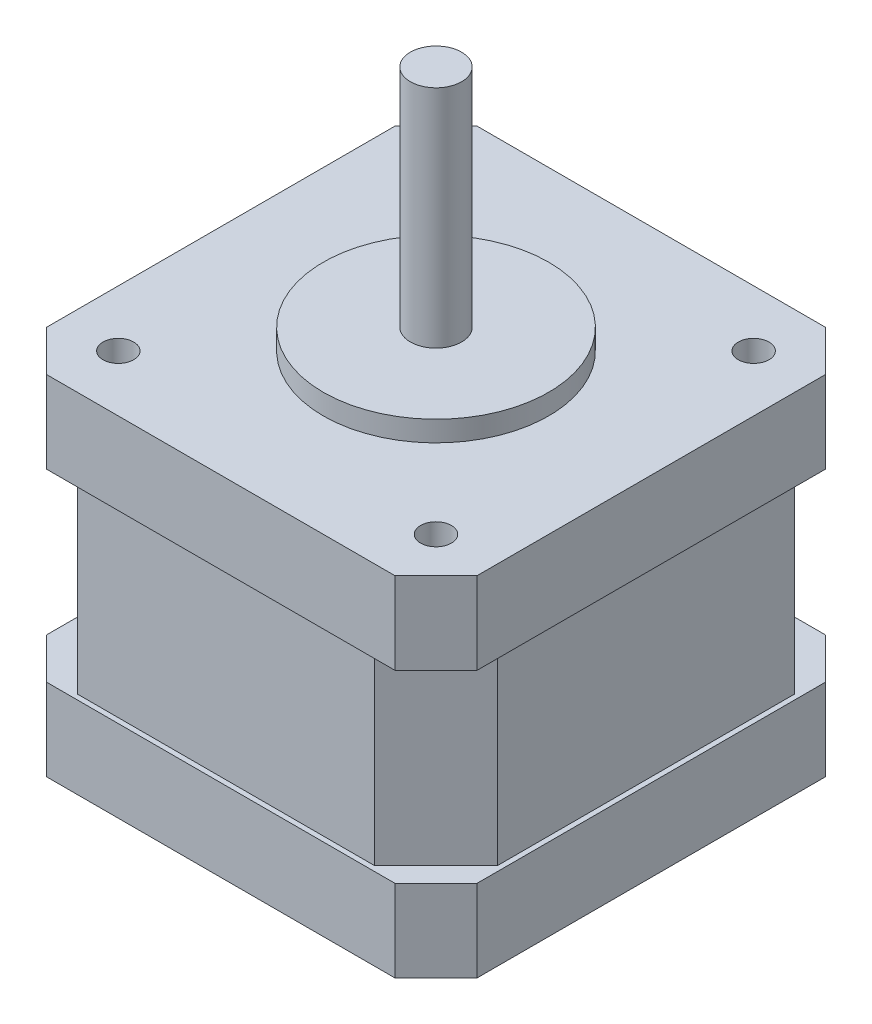
ISO-10303-21;
HEADER;
FILE_DESCRIPTION(('STEP AP214'),'2;1');
FILE_NAME('part.step','',(''),(''),'','','');
FILE_SCHEMA(('AUTOMOTIVE_DESIGN { 1 0 10303 214 1 1 1 1 }'));
ENDSEC;
DATA;
#1=APPLICATION_CONTEXT('core data for automotive mechanical design processes');
#2=APPLICATION_PROTOCOL_DEFINITION('international standard','automotive_design',2000,#1);
#3=PRODUCT_CONTEXT('',#1,'mechanical');
#4=PRODUCT('Part','Part','',(#3));
#5=PRODUCT_RELATED_PRODUCT_CATEGORY('part','',(#4));
#6=PRODUCT_DEFINITION_FORMATION('','',#4);
#7=PRODUCT_DEFINITION_CONTEXT('part definition',#1,'design');
#8=PRODUCT_DEFINITION('design','',#6,#7);
#9=PRODUCT_DEFINITION_SHAPE('','',#8);
#10=(LENGTH_UNIT() NAMED_UNIT(*) SI_UNIT(.MILLI.,.METRE.));
#11=(NAMED_UNIT(*) PLANE_ANGLE_UNIT() SI_UNIT($,.RADIAN.));
#12=(NAMED_UNIT(*) SI_UNIT($,.STERADIAN.) SOLID_ANGLE_UNIT());
#13=UNCERTAINTY_MEASURE_WITH_UNIT(LENGTH_MEASURE(1.E-05),#10,'distance_accuracy_value','');
#14=(GEOMETRIC_REPRESENTATION_CONTEXT(3) GLOBAL_UNCERTAINTY_ASSIGNED_CONTEXT((#13)) GLOBAL_UNIT_ASSIGNED_CONTEXT((#10,
#11,#12)) REPRESENTATION_CONTEXT('',''));
#15=CARTESIAN_POINT('',(0.,0.,0.));
#16=DIRECTION('',(0.,0.,1.));
#17=DIRECTION('',(1.,0.,0.));
#18=AXIS2_PLACEMENT_3D('',#15,#16,#17);
#19=CARTESIAN_POINT('',(0.,10.,0.));
#20=DIRECTION('',(0.,1.,0.));
#21=DIRECTION('',(0.,0.,1.));
#22=AXIS2_PLACEMENT_3D('',#19,#20,#21);
#23=PLANE('',#22);
#24=CARTESIAN_POINT('',(0.,10.,0.));
#25=DIRECTION('',(0.,1.,0.));
#26=DIRECTION('',(0.,0.,1.));
#27=AXIS2_PLACEMENT_3D('',#24,#25,#26);
#28=CIRCLE('',#27,11.);
#29=CARTESIAN_POINT('',(0.,10.,11.));
#30=VERTEX_POINT('',#29);
#31=EDGE_CURVE('E483',#30,#30,#28,.T.);
#32=ORIENTED_EDGE('',*,*,#31,.T.);
#33=EDGE_LOOP('',(#32));
#34=FACE_BOUND('',#33,.T.);
#35=CARTESIAN_POINT('',(0.,10.,0.));
#36=DIRECTION('',(0.,1.,0.));
#37=DIRECTION('',(0.,0.,1.));
#38=AXIS2_PLACEMENT_3D('',#35,#36,#37);
#39=CIRCLE('',#38,2.5);
#40=CARTESIAN_POINT('',(0.,10.,2.5));
#41=VERTEX_POINT('',#40);
#42=EDGE_CURVE('E499',#41,#41,#39,.T.);
#43=ORIENTED_EDGE('',*,*,#42,.F.);
#44=EDGE_LOOP('',(#43));
#45=FACE_BOUND('',#44,.T.);
#46=ADVANCED_FACE('F36',(#34,#45),#23,.T.);
#47=CARTESIAN_POINT('',(0.,8.,0.));
#48=DIRECTION('',(0.,1.,0.));
#49=DIRECTION('',(0.,0.,1.));
#50=AXIS2_PLACEMENT_3D('',#47,#48,#49);
#51=PLANE('',#50);
#52=CARTESIAN_POINT('',(-15.5,8.,15.5));
#53=DIRECTION('',(0.,1.,0.));
#54=DIRECTION('',(0.,0.,1.));
#55=AXIS2_PLACEMENT_3D('',#52,#53,#54);
#56=CIRCLE('',#55,1.5);
#57=CARTESIAN_POINT('',(-15.5,8.,17.));
#58=VERTEX_POINT('',#57);
#59=EDGE_CURVE('E523',#58,#58,#56,.T.);
#60=ORIENTED_EDGE('',*,*,#59,.F.);
#61=EDGE_LOOP('',(#60));
#62=FACE_BOUND('',#61,.T.);
#63=CARTESIAN_POINT('',(15.5,8.,15.5));
#64=DIRECTION('',(0.,1.,0.));
#65=DIRECTION('',(0.,0.,1.));
#66=AXIS2_PLACEMENT_3D('',#63,#64,#65);
#67=CIRCLE('',#66,1.5);
#68=CARTESIAN_POINT('',(15.5,8.,17.));
#69=VERTEX_POINT('',#68);
#70=EDGE_CURVE('E517',#69,#69,#67,.T.);
#71=ORIENTED_EDGE('',*,*,#70,.F.);
#72=EDGE_LOOP('',(#71));
#73=FACE_BOUND('',#72,.T.);
#74=CARTESIAN_POINT('',(15.5,8.,-15.5));
#75=DIRECTION('',(0.,1.,0.));
#76=DIRECTION('',(0.,0.,1.));
#77=AXIS2_PLACEMENT_3D('',#74,#75,#76);
#78=CIRCLE('',#77,1.5);
#79=CARTESIAN_POINT('',(15.5,8.,-14.));
#80=VERTEX_POINT('',#79);
#81=EDGE_CURVE('E511',#80,#80,#78,.T.);
#82=ORIENTED_EDGE('',*,*,#81,.F.);
#83=EDGE_LOOP('',(#82));
#84=FACE_BOUND('',#83,.T.);
#85=CARTESIAN_POINT('',(-15.5,8.,-15.5));
#86=DIRECTION('',(0.,1.,0.));
#87=DIRECTION('',(0.,0.,1.));
#88=AXIS2_PLACEMENT_3D('',#85,#86,#87);
#89=CIRCLE('',#88,1.5);
#90=CARTESIAN_POINT('',(-15.5,8.,-14.));
#91=VERTEX_POINT('',#90);
#92=EDGE_CURVE('E505',#91,#91,#89,.T.);
#93=ORIENTED_EDGE('',*,*,#92,.F.);
#94=EDGE_LOOP('',(#93));
#95=FACE_BOUND('',#94,.T.);
#96=DIRECTION('',(-1.,0.,0.));
#97=VECTOR('',#96,1.);
#98=CARTESIAN_POINT('',(-21.,8.,-21.));
#99=LINE('',#98,#97);
#100=CARTESIAN_POINT('',(17.,8.,-21.));
#101=VERTEX_POINT('',#100);
#102=CARTESIAN_POINT('',(-17.,8.,-21.));
#103=VERTEX_POINT('',#102);
#104=EDGE_CURVE('E209',#101,#103,#99,.T.);
#105=ORIENTED_EDGE('',*,*,#104,.T.);
#106=DIRECTION('',(0.707106781186549,0.,-0.707106781186546));
#107=VECTOR('',#106,1.);
#108=CARTESIAN_POINT('',(-19.,8.,-19.));
#109=LINE('',#108,#107);
#110=CARTESIAN_POINT('',(-21.,8.,-17.));
#111=VERTEX_POINT('',#110);
#112=EDGE_CURVE('E297',#103,#111,#109,.F.);
#113=ORIENTED_EDGE('',*,*,#112,.T.);
#114=DIRECTION('',(0.,0.,1.));
#115=VECTOR('',#114,1.);
#116=CARTESIAN_POINT('',(-21.,8.,-21.));
#117=LINE('',#116,#115);
#118=CARTESIAN_POINT('',(-21.,8.,17.));
#119=VERTEX_POINT('',#118);
#120=EDGE_CURVE('E321',#111,#119,#117,.T.);
#121=ORIENTED_EDGE('',*,*,#120,.T.);
#122=DIRECTION('',(-0.707106781186546,0.,-0.707106781186549));
#123=VECTOR('',#122,1.);
#124=CARTESIAN_POINT('',(-19.,8.,19.));
#125=LINE('',#124,#123);
#126=CARTESIAN_POINT('',(-17.,8.,21.));
#127=VERTEX_POINT('',#126);
#128=EDGE_CURVE('E295',#119,#127,#125,.F.);
#129=ORIENTED_EDGE('',*,*,#128,.T.);
#130=DIRECTION('',(1.,0.,0.));
#131=VECTOR('',#130,1.);
#132=CARTESIAN_POINT('',(-21.,8.,21.));
#133=LINE('',#132,#131);
#134=CARTESIAN_POINT('',(17.,8.,21.));
#135=VERTEX_POINT('',#134);
#136=EDGE_CURVE('E439',#127,#135,#133,.T.);
#137=ORIENTED_EDGE('',*,*,#136,.T.);
#138=DIRECTION('',(-0.707106781186548,0.,0.707106781186547));
#139=VECTOR('',#138,1.);
#140=CARTESIAN_POINT('',(19.,8.,19.));
#141=LINE('',#140,#139);
#142=CARTESIAN_POINT('',(21.,8.,17.));
#143=VERTEX_POINT('',#142);
#144=EDGE_CURVE('E56',#135,#143,#141,.F.);
#145=ORIENTED_EDGE('',*,*,#144,.T.);
#146=DIRECTION('',(0.,0.,-1.));
#147=VECTOR('',#146,1.);
#148=CARTESIAN_POINT('',(21.,8.,-21.));
#149=LINE('',#148,#147);
#150=CARTESIAN_POINT('',(21.,8.,-17.));
#151=VERTEX_POINT('',#150);
#152=EDGE_CURVE('E308',#143,#151,#149,.T.);
#153=ORIENTED_EDGE('',*,*,#152,.T.);
#154=DIRECTION('',(0.707106781186547,0.,0.707106781186548));
#155=VECTOR('',#154,1.);
#156=CARTESIAN_POINT('',(19.,8.,-19.));
#157=LINE('',#156,#155);
#158=EDGE_CURVE('E293',#151,#101,#157,.F.);
#159=ORIENTED_EDGE('',*,*,#158,.T.);
#160=EDGE_LOOP('',(#105,#113,#121,#129,#137,#145,#153,#159));
#161=FACE_BOUND('',#160,.T.);
#162=CARTESIAN_POINT('',(0.,8.,0.));
#163=DIRECTION('',(0.,1.,0.));
#164=DIRECTION('',(0.,0.,1.));
#165=AXIS2_PLACEMENT_3D('',#162,#163,#164);
#166=CIRCLE('',#165,11.);
#167=CARTESIAN_POINT('',(0.,8.,11.));
#168=VERTEX_POINT('',#167);
#169=EDGE_CURVE('E494',#168,#168,#166,.T.);
#170=ORIENTED_EDGE('',*,*,#169,.F.);
#171=EDGE_LOOP('',(#170));
#172=FACE_BOUND('',#171,.T.);
#173=ADVANCED_FACE('F369',(#62,#73,#84,#95,#161,#172),#51,.T.);
#174=CARTESIAN_POINT('',(0.,0.,0.));
#175=DIRECTION('',(0.,1.,0.));
#176=DIRECTION('',(0.,0.,1.));
#177=AXIS2_PLACEMENT_3D('',#174,#175,#176);
#178=PLANE('',#177);
#179=DIRECTION('',(0.,0.,1.));
#180=VECTOR('',#179,1.);
#181=CARTESIAN_POINT('',(-21.,0.,-21.));
#182=LINE('',#181,#180);
#183=CARTESIAN_POINT('',(-21.,0.,-17.));
#184=VERTEX_POINT('',#183);
#185=CARTESIAN_POINT('',(-21.,0.,17.));
#186=VERTEX_POINT('',#185);
#187=EDGE_CURVE('E323',#184,#186,#182,.T.);
#188=ORIENTED_EDGE('',*,*,#187,.F.);
#189=DIRECTION('',(-0.707106781186549,0.,0.707106781186546));
#190=VECTOR('',#189,1.);
#191=CARTESIAN_POINT('',(-21.,0.,-17.));
#192=LINE('',#191,#190);
#193=CARTESIAN_POINT('',(-17.,0.,-21.));
#194=VERTEX_POINT('',#193);
#195=EDGE_CURVE('E285',#184,#194,#192,.F.);
#196=ORIENTED_EDGE('',*,*,#195,.T.);
#197=DIRECTION('',(-1.,0.,0.));
#198=VECTOR('',#197,1.);
#199=CARTESIAN_POINT('',(-21.,0.,-21.));
#200=LINE('',#199,#198);
#201=CARTESIAN_POINT('',(17.,0.,-21.));
#202=VERTEX_POINT('',#201);
#203=EDGE_CURVE('E317',#202,#194,#200,.T.);
#204=ORIENTED_EDGE('',*,*,#203,.F.);
#205=DIRECTION('',(-0.707106781186547,0.,-0.707106781186548));
#206=VECTOR('',#205,1.);
#207=CARTESIAN_POINT('',(17.,0.,-21.));
#208=LINE('',#207,#206);
#209=CARTESIAN_POINT('',(21.,0.,-17.));
#210=VERTEX_POINT('',#209);
#211=EDGE_CURVE('E281',#202,#210,#208,.F.);
#212=ORIENTED_EDGE('',*,*,#211,.T.);
#213=DIRECTION('',(0.,0.,-1.));
#214=VECTOR('',#213,1.);
#215=CARTESIAN_POINT('',(21.,0.,-21.));
#216=LINE('',#215,#214);
#217=CARTESIAN_POINT('',(21.,0.,17.));
#218=VERTEX_POINT('',#217);
#219=EDGE_CURVE('E307',#218,#210,#216,.T.);
#220=ORIENTED_EDGE('',*,*,#219,.F.);
#221=DIRECTION('',(0.707106781186548,0.,-0.707106781186547));
#222=VECTOR('',#221,1.);
#223=CARTESIAN_POINT('',(21.,0.,17.));
#224=LINE('',#223,#222);
#225=CARTESIAN_POINT('',(17.,0.,21.));
#226=VERTEX_POINT('',#225);
#227=EDGE_CURVE('E279',#218,#226,#224,.F.);
#228=ORIENTED_EDGE('',*,*,#227,.T.);
#229=DIRECTION('',(1.,0.,0.));
#230=VECTOR('',#229,1.);
#231=CARTESIAN_POINT('',(-21.,0.,21.));
#232=LINE('',#231,#230);
#233=CARTESIAN_POINT('',(-17.,0.,21.));
#234=VERTEX_POINT('',#233);
#235=EDGE_CURVE('E318',#234,#226,#232,.T.);
#236=ORIENTED_EDGE('',*,*,#235,.F.);
#237=DIRECTION('',(0.707106781186546,0.,0.707106781186549));
#238=VECTOR('',#237,1.);
#239=CARTESIAN_POINT('',(-17.,0.,21.));
#240=LINE('',#239,#238);
#241=EDGE_CURVE('E283',#234,#186,#240,.F.);
#242=ORIENTED_EDGE('',*,*,#241,.T.);
#243=EDGE_LOOP('',(#188,#196,#204,#212,#220,#228,#236,#242));
#244=FACE_BOUND('',#243,.T.);
#245=DIRECTION('',(-1.,0.,0.));
#246=VECTOR('',#245,1.);
#247=CARTESIAN_POINT('',(20.5,0.,20.5));
#248=LINE('',#247,#246);
#249=CARTESIAN_POINT('',(14.5,0.,20.5));
#250=VERTEX_POINT('',#249);
#251=CARTESIAN_POINT('',(-14.5,0.,20.5));
#252=VERTEX_POINT('',#251);
#253=EDGE_CURVE('E455',#250,#252,#248,.T.);
#254=ORIENTED_EDGE('',*,*,#253,.F.);
#255=DIRECTION('',(-0.707106781186546,0.,0.707106781186549));
#256=VECTOR('',#255,1.);
#257=CARTESIAN_POINT('',(17.5,0.,17.5));
#258=LINE('',#257,#256);
#259=CARTESIAN_POINT('',(20.5,0.,14.5));
#260=VERTEX_POINT('',#259);
#261=EDGE_CURVE('E226',#250,#260,#258,.F.);
#262=ORIENTED_EDGE('',*,*,#261,.T.);
#263=DIRECTION('',(0.,0.,1.));
#264=VECTOR('',#263,1.);
#265=CARTESIAN_POINT('',(20.5,0.,-20.5));
#266=LINE('',#265,#264);
#267=CARTESIAN_POINT('',(20.5,0.,-14.5));
#268=VERTEX_POINT('',#267);
#269=EDGE_CURVE('E205',#268,#260,#266,.T.);
#270=ORIENTED_EDGE('',*,*,#269,.F.);
#271=DIRECTION('',(0.707106781186549,0.,0.707106781186546));
#272=VECTOR('',#271,1.);
#273=CARTESIAN_POINT('',(17.4999999999999,0.,-17.5));
#274=LINE('',#273,#272);
#275=CARTESIAN_POINT('',(14.5,0.,-20.5));
#276=VERTEX_POINT('',#275);
#277=EDGE_CURVE('E341',#268,#276,#274,.F.);
#278=ORIENTED_EDGE('',*,*,#277,.T.);
#279=DIRECTION('',(1.,0.,0.));
#280=VECTOR('',#279,1.);
#281=CARTESIAN_POINT('',(-20.5,0.,-20.5));
#282=LINE('',#281,#280);
#283=CARTESIAN_POINT('',(-14.5,0.,-20.5));
#284=VERTEX_POINT('',#283);
#285=EDGE_CURVE('E345',#284,#276,#282,.T.);
#286=ORIENTED_EDGE('',*,*,#285,.F.);
#287=DIRECTION('',(0.707106781186546,0.,-0.707106781186549));
#288=VECTOR('',#287,1.);
#289=CARTESIAN_POINT('',(-17.5,0.,-17.5));
#290=LINE('',#289,#288);
#291=CARTESIAN_POINT('',(-20.5,0.,-14.5));
#292=VERTEX_POINT('',#291);
#293=EDGE_CURVE('E234',#284,#292,#290,.F.);
#294=ORIENTED_EDGE('',*,*,#293,.T.);
#295=DIRECTION('',(0.,0.,-1.));
#296=VECTOR('',#295,1.);
#297=CARTESIAN_POINT('',(-20.5,0.,20.5));
#298=LINE('',#297,#296);
#299=CARTESIAN_POINT('',(-20.5,0.,14.5));
#300=VERTEX_POINT('',#299);
#301=EDGE_CURVE('E352',#300,#292,#298,.T.);
#302=ORIENTED_EDGE('',*,*,#301,.F.);
#303=DIRECTION('',(-0.707106781186549,0.,-0.707106781186546));
#304=VECTOR('',#303,1.);
#305=CARTESIAN_POINT('',(-17.5,0.,17.5));
#306=LINE('',#305,#304);
#307=EDGE_CURVE('E225',#300,#252,#306,.F.);
#308=ORIENTED_EDGE('',*,*,#307,.T.);
#309=EDGE_LOOP('',(#254,#262,#270,#278,#286,#294,#302,#308));
#310=FACE_BOUND('',#309,.T.);
#311=ADVANCED_FACE('F312',(#244,#310),#178,.F.);
#312=CARTESIAN_POINT('',(-21.,8.,-21.));
#313=DIRECTION('',(1.,0.,0.));
#314=DIRECTION('',(0.,0.,-1.));
#315=AXIS2_PLACEMENT_3D('',#312,#313,#314);
#316=PLANE('',#315);
#317=ORIENTED_EDGE('',*,*,#120,.F.);
#318=DIRECTION('',(0.,-1.,0.));
#319=VECTOR('',#318,1.);
#320=CARTESIAN_POINT('',(-21.,8.,-17.));
#321=LINE('',#320,#319);
#322=EDGE_CURVE('E276',#111,#184,#321,.T.);
#323=ORIENTED_EDGE('',*,*,#322,.T.);
#324=ORIENTED_EDGE('',*,*,#187,.T.);
#325=DIRECTION('',(0.,1.,0.));
#326=VECTOR('',#325,1.);
#327=CARTESIAN_POINT('',(-21.,8.,17.));
#328=LINE('',#327,#326);
#329=EDGE_CURVE('E274',#186,#119,#328,.T.);
#330=ORIENTED_EDGE('',*,*,#329,.T.);
#331=EDGE_LOOP('',(#317,#323,#324,#330));
#332=FACE_BOUND('',#331,.T.);
#333=ADVANCED_FACE('F420',(#332),#316,.F.);
#334=CARTESIAN_POINT('',(-21.,8.,21.));
#335=DIRECTION('',(0.,0.,-1.));
#336=DIRECTION('',(-1.,0.,0.));
#337=AXIS2_PLACEMENT_3D('',#334,#335,#336);
#338=PLANE('',#337);
#339=ORIENTED_EDGE('',*,*,#136,.F.);
#340=DIRECTION('',(0.,-1.,0.));
#341=VECTOR('',#340,1.);
#342=CARTESIAN_POINT('',(-17.,8.,21.));
#343=LINE('',#342,#341);
#344=EDGE_CURVE('E301',#127,#234,#343,.T.);
#345=ORIENTED_EDGE('',*,*,#344,.T.);
#346=ORIENTED_EDGE('',*,*,#235,.T.);
#347=DIRECTION('',(0.,1.,0.));
#348=VECTOR('',#347,1.);
#349=CARTESIAN_POINT('',(17.,8.,21.));
#350=LINE('',#349,#348);
#351=EDGE_CURVE('E299',#226,#135,#350,.T.);
#352=ORIENTED_EDGE('',*,*,#351,.T.);
#353=EDGE_LOOP('',(#339,#345,#346,#352));
#354=FACE_BOUND('',#353,.T.);
#355=ADVANCED_FACE('F426',(#354),#338,.F.);
#356=CARTESIAN_POINT('',(21.,8.,-21.));
#357=DIRECTION('',(-1.,0.,0.));
#358=DIRECTION('',(0.,0.,1.));
#359=AXIS2_PLACEMENT_3D('',#356,#357,#358);
#360=PLANE('',#359);
#361=ORIENTED_EDGE('',*,*,#219,.T.);
#362=DIRECTION('',(0.,1.,0.));
#363=VECTOR('',#362,1.);
#364=CARTESIAN_POINT('',(21.,8.,-17.));
#365=LINE('',#364,#363);
#366=EDGE_CURVE('E11',#210,#151,#365,.T.);
#367=ORIENTED_EDGE('',*,*,#366,.T.);
#368=ORIENTED_EDGE('',*,*,#152,.F.);
#369=DIRECTION('',(0.,-1.,0.));
#370=VECTOR('',#369,1.);
#371=CARTESIAN_POINT('',(21.,8.,17.));
#372=LINE('',#371,#370);
#373=EDGE_CURVE('E44',#143,#218,#372,.T.);
#374=ORIENTED_EDGE('',*,*,#373,.T.);
#375=EDGE_LOOP('',(#361,#367,#368,#374));
#376=FACE_BOUND('',#375,.T.);
#377=ADVANCED_FACE('F306',(#376),#360,.F.);
#378=CARTESIAN_POINT('',(-21.,8.,-21.));
#379=DIRECTION('',(0.,0.,1.));
#380=DIRECTION('',(1.,0.,0.));
#381=AXIS2_PLACEMENT_3D('',#378,#379,#380);
#382=PLANE('',#381);
#383=ORIENTED_EDGE('',*,*,#203,.T.);
#384=DIRECTION('',(0.,1.,0.));
#385=VECTOR('',#384,1.);
#386=CARTESIAN_POINT('',(-17.,8.,-21.));
#387=LINE('',#386,#385);
#388=EDGE_CURVE('E290',#194,#103,#387,.T.);
#389=ORIENTED_EDGE('',*,*,#388,.T.);
#390=ORIENTED_EDGE('',*,*,#104,.F.);
#391=DIRECTION('',(0.,-1.,0.));
#392=VECTOR('',#391,1.);
#393=CARTESIAN_POINT('',(17.,8.,-21.));
#394=LINE('',#393,#392);
#395=EDGE_CURVE('E287',#101,#202,#394,.T.);
#396=ORIENTED_EDGE('',*,*,#395,.T.);
#397=EDGE_LOOP('',(#383,#389,#390,#396));
#398=FACE_BOUND('',#397,.T.);
#399=ADVANCED_FACE('F414',(#398),#382,.F.);
#400=CARTESIAN_POINT('',(20.5,-500000.,20.5));
#401=DIRECTION('',(0.,0.,-1.));
#402=DIRECTION('',(-1.,0.,0.));
#403=AXIS2_PLACEMENT_3D('',#400,#401,#402);
#404=PLANE('',#403);
#405=DIRECTION('',(1.,0.,0.));
#406=VECTOR('',#405,1.);
#407=CARTESIAN_POINT('',(20.5,-17.9999999999723,20.5));
#408=LINE('',#407,#406);
#409=CARTESIAN_POINT('',(-14.5,-17.9999999999723,20.5));
#410=VERTEX_POINT('',#409);
#411=CARTESIAN_POINT('',(14.5,-17.9999999999723,20.5));
#412=VERTEX_POINT('',#411);
#413=EDGE_CURVE('E467',#410,#412,#408,.T.);
#414=ORIENTED_EDGE('',*,*,#413,.T.);
#415=DIRECTION('',(0.,1.,0.));
#416=VECTOR('',#415,1.);
#417=CARTESIAN_POINT('',(14.5,-500000.,20.5));
#418=LINE('',#417,#416);
#419=EDGE_CURVE('E224',#412,#250,#418,.T.);
#420=ORIENTED_EDGE('',*,*,#419,.T.);
#421=ORIENTED_EDGE('',*,*,#253,.T.);
#422=DIRECTION('',(0.,-1.,0.));
#423=VECTOR('',#422,1.);
#424=CARTESIAN_POINT('',(-14.5,-500000.,20.5));
#425=LINE('',#424,#423);
#426=EDGE_CURVE('E333',#252,#410,#425,.T.);
#427=ORIENTED_EDGE('',*,*,#426,.T.);
#428=EDGE_LOOP('',(#414,#420,#421,#427));
#429=FACE_BOUND('',#428,.T.);
#430=ADVANCED_FACE('F390',(#429),#404,.F.);
#431=CARTESIAN_POINT('',(-20.5,-500000.,20.5));
#432=DIRECTION('',(1.,0.,0.));
#433=DIRECTION('',(0.,0.,-1.));
#434=AXIS2_PLACEMENT_3D('',#431,#432,#433);
#435=PLANE('',#434);
#436=DIRECTION('',(0.,0.,1.));
#437=VECTOR('',#436,1.);
#438=CARTESIAN_POINT('',(-20.5,-17.9999999999723,20.5));
#439=LINE('',#438,#437);
#440=CARTESIAN_POINT('',(-20.5,-17.9999999999723,-14.5));
#441=VERTEX_POINT('',#440);
#442=CARTESIAN_POINT('',(-20.5,-17.9999999999723,14.5));
#443=VERTEX_POINT('',#442);
#444=EDGE_CURVE('E464',#441,#443,#439,.T.);
#445=ORIENTED_EDGE('',*,*,#444,.T.);
#446=DIRECTION('',(0.,1.,0.));
#447=VECTOR('',#446,1.);
#448=CARTESIAN_POINT('',(-20.5,-500000.,14.5));
#449=LINE('',#448,#447);
#450=EDGE_CURVE('E338',#443,#300,#449,.T.);
#451=ORIENTED_EDGE('',*,*,#450,.T.);
#452=ORIENTED_EDGE('',*,*,#301,.T.);
#453=DIRECTION('',(0.,-1.,0.));
#454=VECTOR('',#453,1.);
#455=CARTESIAN_POINT('',(-20.5,-500000.,-14.5));
#456=LINE('',#455,#454);
#457=EDGE_CURVE('E336',#292,#441,#456,.T.);
#458=ORIENTED_EDGE('',*,*,#457,.T.);
#459=EDGE_LOOP('',(#445,#451,#452,#458));
#460=FACE_BOUND('',#459,.T.);
#461=ADVANCED_FACE('F406',(#460),#435,.F.);
#462=CARTESIAN_POINT('',(-20.5,-500000.,-20.5));
#463=DIRECTION('',(0.,0.,1.));
#464=DIRECTION('',(1.,0.,0.));
#465=AXIS2_PLACEMENT_3D('',#462,#463,#464);
#466=PLANE('',#465);
#467=ORIENTED_EDGE('',*,*,#285,.T.);
#468=DIRECTION('',(0.,-1.,0.));
#469=VECTOR('',#468,1.);
#470=CARTESIAN_POINT('',(14.5,-500000.,-20.5));
#471=LINE('',#470,#469);
#472=CARTESIAN_POINT('',(14.5,-17.9999999999723,-20.5));
#473=VERTEX_POINT('',#472);
#474=EDGE_CURVE('E331',#276,#473,#471,.T.);
#475=ORIENTED_EDGE('',*,*,#474,.T.);
#476=DIRECTION('',(-1.,0.,0.));
#477=VECTOR('',#476,1.);
#478=CARTESIAN_POINT('',(-20.5,-17.9999999999723,-20.5));
#479=LINE('',#478,#477);
#480=CARTESIAN_POINT('',(-14.5,-17.9999999999723,-20.5));
#481=VERTEX_POINT('',#480);
#482=EDGE_CURVE('E219',#473,#481,#479,.T.);
#483=ORIENTED_EDGE('',*,*,#482,.T.);
#484=DIRECTION('',(0.,1.,0.));
#485=VECTOR('',#484,1.);
#486=CARTESIAN_POINT('',(-14.5,-500000.,-20.5));
#487=LINE('',#486,#485);
#488=EDGE_CURVE('E328',#481,#284,#487,.T.);
#489=ORIENTED_EDGE('',*,*,#488,.T.);
#490=EDGE_LOOP('',(#467,#475,#483,#489));
#491=FACE_BOUND('',#490,.T.);
#492=ADVANCED_FACE('F349',(#491),#466,.F.);
#493=CARTESIAN_POINT('',(20.5,-500000.,-20.5));
#494=DIRECTION('',(-1.,0.,0.));
#495=DIRECTION('',(0.,0.,1.));
#496=AXIS2_PLACEMENT_3D('',#493,#494,#495);
#497=PLANE('',#496);
#498=DIRECTION('',(0.,0.,-1.));
#499=VECTOR('',#498,1.);
#500=CARTESIAN_POINT('',(20.5,-17.9999999999723,-20.5));
#501=LINE('',#500,#499);
#502=CARTESIAN_POINT('',(20.5,-17.9999999999723,14.5));
#503=VERTEX_POINT('',#502);
#504=CARTESIAN_POINT('',(20.5,-17.9999999999723,-14.5));
#505=VERTEX_POINT('',#504);
#506=EDGE_CURVE('E202',#503,#505,#501,.T.);
#507=ORIENTED_EDGE('',*,*,#506,.T.);
#508=DIRECTION('',(0.,1.,0.));
#509=VECTOR('',#508,1.);
#510=CARTESIAN_POINT('',(20.5,-500000.,-14.5));
#511=LINE('',#510,#509);
#512=EDGE_CURVE('E208',#505,#268,#511,.T.);
#513=ORIENTED_EDGE('',*,*,#512,.T.);
#514=ORIENTED_EDGE('',*,*,#269,.T.);
#515=DIRECTION('',(0.,-1.,0.));
#516=VECTOR('',#515,1.);
#517=CARTESIAN_POINT('',(20.5,-500000.,14.5));
#518=LINE('',#517,#516);
#519=EDGE_CURVE('E198',#260,#503,#518,.T.);
#520=ORIENTED_EDGE('',*,*,#519,.T.);
#521=EDGE_LOOP('',(#507,#513,#514,#520));
#522=FACE_BOUND('',#521,.T.);
#523=ADVANCED_FACE('F200',(#522),#497,.F.);
#524=CARTESIAN_POINT('',(0.,-18.,0.));
#525=DIRECTION('',(0.,1.,0.));
#526=DIRECTION('',(0.,0.,1.));
#527=AXIS2_PLACEMENT_3D('',#524,#525,#526);
#528=PLANE('',#527);
#529=DIRECTION('',(-1.,0.,0.));
#530=VECTOR('',#529,1.);
#531=CARTESIAN_POINT('',(-21.,-18.,-21.));
#532=LINE('',#531,#530);
#533=CARTESIAN_POINT('',(17.,-18.,-21.));
#534=VERTEX_POINT('',#533);
#535=CARTESIAN_POINT('',(-17.,-18.,-21.));
#536=VERTEX_POINT('',#535);
#537=EDGE_CURVE('E469',#534,#536,#532,.T.);
#538=ORIENTED_EDGE('',*,*,#537,.T.);
#539=DIRECTION('',(0.707106781186549,0.,-0.707106781186546));
#540=VECTOR('',#539,1.);
#541=CARTESIAN_POINT('',(-19.,-18.,-19.));
#542=LINE('',#541,#540);
#543=CARTESIAN_POINT('',(-21.,-18.,-17.));
#544=VERTEX_POINT('',#543);
#545=EDGE_CURVE('E262',#536,#544,#542,.F.);
#546=ORIENTED_EDGE('',*,*,#545,.T.);
#547=DIRECTION('',(0.,0.,1.));
#548=VECTOR('',#547,1.);
#549=CARTESIAN_POINT('',(-21.,-18.,-21.));
#550=LINE('',#549,#548);
#551=CARTESIAN_POINT('',(-21.,-18.,17.));
#552=VERTEX_POINT('',#551);
#553=EDGE_CURVE('E473',#544,#552,#550,.T.);
#554=ORIENTED_EDGE('',*,*,#553,.T.);
#555=DIRECTION('',(-0.707106781186546,0.,-0.707106781186549));
#556=VECTOR('',#555,1.);
#557=CARTESIAN_POINT('',(-19.,-18.,19.));
#558=LINE('',#557,#556);
#559=CARTESIAN_POINT('',(-17.,-18.,21.));
#560=VERTEX_POINT('',#559);
#561=EDGE_CURVE('E260',#552,#560,#558,.F.);
#562=ORIENTED_EDGE('',*,*,#561,.T.);
#563=DIRECTION('',(1.,0.,0.));
#564=VECTOR('',#563,1.);
#565=CARTESIAN_POINT('',(-21.,-18.,21.));
#566=LINE('',#565,#564);
#567=CARTESIAN_POINT('',(17.,-18.,21.));
#568=VERTEX_POINT('',#567);
#569=EDGE_CURVE('E489',#560,#568,#566,.T.);
#570=ORIENTED_EDGE('',*,*,#569,.T.);
#571=DIRECTION('',(-0.707106781186548,0.,0.707106781186547));
#572=VECTOR('',#571,1.);
#573=CARTESIAN_POINT('',(19.,-18.,19.));
#574=LINE('',#573,#572);
#575=CARTESIAN_POINT('',(21.,-18.,17.));
#576=VERTEX_POINT('',#575);
#577=EDGE_CURVE('E256',#568,#576,#574,.F.);
#578=ORIENTED_EDGE('',*,*,#577,.T.);
#579=DIRECTION('',(0.,0.,-1.));
#580=VECTOR('',#579,1.);
#581=CARTESIAN_POINT('',(21.,-18.,-21.));
#582=LINE('',#581,#580);
#583=CARTESIAN_POINT('',(21.,-18.,-17.));
#584=VERTEX_POINT('',#583);
#585=EDGE_CURVE('E486',#576,#584,#582,.T.);
#586=ORIENTED_EDGE('',*,*,#585,.T.);
#587=DIRECTION('',(0.707106781186547,0.,0.707106781186548));
#588=VECTOR('',#587,1.);
#589=CARTESIAN_POINT('',(19.,-18.,-19.));
#590=LINE('',#589,#588);
#591=EDGE_CURVE('E258',#584,#534,#590,.F.);
#592=ORIENTED_EDGE('',*,*,#591,.T.);
#593=EDGE_LOOP('',(#538,#546,#554,#562,#570,#578,#586,#592));
#594=FACE_BOUND('',#593,.T.);
#595=ORIENTED_EDGE('',*,*,#413,.F.);
#596=DIRECTION('',(0.707106781186549,0.,0.707106781186546));
#597=VECTOR('',#596,1.);
#598=CARTESIAN_POINT('',(-20.5,-17.9999999999723,14.5));
#599=LINE('',#598,#597);
#600=EDGE_CURVE('E228',#410,#443,#599,.F.);
#601=ORIENTED_EDGE('',*,*,#600,.T.);
#602=ORIENTED_EDGE('',*,*,#444,.F.);
#603=DIRECTION('',(-0.707106781186546,0.,0.707106781186549));
#604=VECTOR('',#603,1.);
#605=CARTESIAN_POINT('',(-14.5,-17.9999999999723,-20.5));
#606=LINE('',#605,#604);
#607=EDGE_CURVE('E236',#441,#481,#606,.F.);
#608=ORIENTED_EDGE('',*,*,#607,.T.);
#609=ORIENTED_EDGE('',*,*,#482,.F.);
#610=DIRECTION('',(-0.707106781186549,0.,-0.707106781186546));
#611=VECTOR('',#610,1.);
#612=CARTESIAN_POINT('',(20.5,-17.9999999999723,-14.5));
#613=LINE('',#612,#611);
#614=EDGE_CURVE('E218',#473,#505,#613,.F.);
#615=ORIENTED_EDGE('',*,*,#614,.T.);
#616=ORIENTED_EDGE('',*,*,#506,.F.);
#617=DIRECTION('',(0.707106781186546,0.,-0.707106781186549));
#618=VECTOR('',#617,1.);
#619=CARTESIAN_POINT('',(14.5,-17.9999999999723,20.5));
#620=LINE('',#619,#618);
#621=EDGE_CURVE('E214',#503,#412,#620,.F.);
#622=ORIENTED_EDGE('',*,*,#621,.T.);
#623=EDGE_LOOP('',(#595,#601,#602,#608,#609,#615,#616,#622));
#624=FACE_BOUND('',#623,.T.);
#625=ADVANCED_FACE('F213',(#594,#624),#528,.T.);
#626=CARTESIAN_POINT('',(-21.,-18.,-21.));
#627=DIRECTION('',(1.,0.,0.));
#628=DIRECTION('',(0.,0.,-1.));
#629=AXIS2_PLACEMENT_3D('',#626,#627,#628);
#630=PLANE('',#629);
#631=ORIENTED_EDGE('',*,*,#553,.F.);
#632=DIRECTION('',(0.,-1.,0.));
#633=VECTOR('',#632,1.);
#634=CARTESIAN_POINT('',(-21.,-18.,-17.));
#635=LINE('',#634,#633);
#636=CARTESIAN_POINT('',(-21.,-26.,-17.));
#637=VERTEX_POINT('',#636);
#638=EDGE_CURVE('E240',#544,#637,#635,.T.);
#639=ORIENTED_EDGE('',*,*,#638,.T.);
#640=DIRECTION('',(0.,0.,1.));
#641=VECTOR('',#640,1.);
#642=CARTESIAN_POINT('',(-21.,-26.,-21.));
#643=LINE('',#642,#641);
#644=CARTESIAN_POINT('',(-21.,-26.,17.));
#645=VERTEX_POINT('',#644);
#646=EDGE_CURVE('E480',#637,#645,#643,.T.);
#647=ORIENTED_EDGE('',*,*,#646,.T.);
#648=DIRECTION('',(0.,1.,0.));
#649=VECTOR('',#648,1.);
#650=CARTESIAN_POINT('',(-21.,-18.,17.));
#651=LINE('',#650,#649);
#652=EDGE_CURVE('E238',#645,#552,#651,.T.);
#653=ORIENTED_EDGE('',*,*,#652,.T.);
#654=EDGE_LOOP('',(#631,#639,#647,#653));
#655=FACE_BOUND('',#654,.T.);
#656=ADVANCED_FACE('F388',(#655),#630,.F.);
#657=CARTESIAN_POINT('',(-21.,-18.,21.));
#658=DIRECTION('',(0.,0.,-1.));
#659=DIRECTION('',(-1.,0.,0.));
#660=AXIS2_PLACEMENT_3D('',#657,#658,#659);
#661=PLANE('',#660);
#662=ORIENTED_EDGE('',*,*,#569,.F.);
#663=DIRECTION('',(0.,-1.,0.));
#664=VECTOR('',#663,1.);
#665=CARTESIAN_POINT('',(-17.,-18.,21.));
#666=LINE('',#665,#664);
#667=CARTESIAN_POINT('',(-17.,-26.,21.));
#668=VERTEX_POINT('',#667);
#669=EDGE_CURVE('E266',#560,#668,#666,.T.);
#670=ORIENTED_EDGE('',*,*,#669,.T.);
#671=DIRECTION('',(1.,0.,0.));
#672=VECTOR('',#671,1.);
#673=CARTESIAN_POINT('',(-21.,-26.,21.));
#674=LINE('',#673,#672);
#675=CARTESIAN_POINT('',(17.,-26.,21.));
#676=VERTEX_POINT('',#675);
#677=EDGE_CURVE('E477',#668,#676,#674,.T.);
#678=ORIENTED_EDGE('',*,*,#677,.T.);
#679=DIRECTION('',(0.,1.,0.));
#680=VECTOR('',#679,1.);
#681=CARTESIAN_POINT('',(17.,-18.,21.));
#682=LINE('',#681,#680);
#683=EDGE_CURVE('E264',#676,#568,#682,.T.);
#684=ORIENTED_EDGE('',*,*,#683,.T.);
#685=EDGE_LOOP('',(#662,#670,#678,#684));
#686=FACE_BOUND('',#685,.T.);
#687=ADVANCED_FACE('F398',(#686),#661,.F.);
#688=CARTESIAN_POINT('',(21.,-18.,-21.));
#689=DIRECTION('',(-1.,0.,0.));
#690=DIRECTION('',(0.,0.,1.));
#691=AXIS2_PLACEMENT_3D('',#688,#689,#690);
#692=PLANE('',#691);
#693=DIRECTION('',(0.,0.,-1.));
#694=VECTOR('',#693,1.);
#695=CARTESIAN_POINT('',(21.,-26.,-21.));
#696=LINE('',#695,#694);
#697=CARTESIAN_POINT('',(21.,-26.,17.));
#698=VERTEX_POINT('',#697);
#699=CARTESIAN_POINT('',(21.,-26.,-17.));
#700=VERTEX_POINT('',#699);
#701=EDGE_CURVE('E474',#698,#700,#696,.T.);
#702=ORIENTED_EDGE('',*,*,#701,.T.);
#703=DIRECTION('',(0.,1.,0.));
#704=VECTOR('',#703,1.);
#705=CARTESIAN_POINT('',(21.,-18.,-17.));
#706=LINE('',#705,#704);
#707=EDGE_CURVE('E272',#700,#584,#706,.T.);
#708=ORIENTED_EDGE('',*,*,#707,.T.);
#709=ORIENTED_EDGE('',*,*,#585,.F.);
#710=DIRECTION('',(0.,-1.,0.));
#711=VECTOR('',#710,1.);
#712=CARTESIAN_POINT('',(21.,-18.,17.));
#713=LINE('',#712,#711);
#714=EDGE_CURVE('E269',#576,#698,#713,.T.);
#715=ORIENTED_EDGE('',*,*,#714,.T.);
#716=EDGE_LOOP('',(#702,#708,#709,#715));
#717=FACE_BOUND('',#716,.T.);
#718=ADVANCED_FACE('F394',(#717),#692,.F.);
#719=CARTESIAN_POINT('',(-21.,-18.,-21.));
#720=DIRECTION('',(0.,0.,1.));
#721=DIRECTION('',(1.,0.,0.));
#722=AXIS2_PLACEMENT_3D('',#719,#720,#721);
#723=PLANE('',#722);
#724=DIRECTION('',(-1.,0.,0.));
#725=VECTOR('',#724,1.);
#726=CARTESIAN_POINT('',(-21.,-26.,-21.));
#727=LINE('',#726,#725);
#728=CARTESIAN_POINT('',(17.,-26.,-21.));
#729=VERTEX_POINT('',#728);
#730=CARTESIAN_POINT('',(-17.,-26.,-21.));
#731=VERTEX_POINT('',#730);
#732=EDGE_CURVE('E470',#729,#731,#727,.T.);
#733=ORIENTED_EDGE('',*,*,#732,.T.);
#734=DIRECTION('',(0.,1.,0.));
#735=VECTOR('',#734,1.);
#736=CARTESIAN_POINT('',(-17.,-18.,-21.));
#737=LINE('',#736,#735);
#738=EDGE_CURVE('E254',#731,#536,#737,.T.);
#739=ORIENTED_EDGE('',*,*,#738,.T.);
#740=ORIENTED_EDGE('',*,*,#537,.F.);
#741=DIRECTION('',(0.,-1.,0.));
#742=VECTOR('',#741,1.);
#743=CARTESIAN_POINT('',(17.,-18.,-21.));
#744=LINE('',#743,#742);
#745=EDGE_CURVE('E251',#534,#729,#744,.T.);
#746=ORIENTED_EDGE('',*,*,#745,.T.);
#747=EDGE_LOOP('',(#733,#739,#740,#746));
#748=FACE_BOUND('',#747,.T.);
#749=ADVANCED_FACE('F364',(#748),#723,.F.);
#750=CARTESIAN_POINT('',(0.,-26.,0.));
#751=DIRECTION('',(0.,1.,0.));
#752=DIRECTION('',(0.,0.,1.));
#753=AXIS2_PLACEMENT_3D('',#750,#751,#752);
#754=PLANE('',#753);
#755=ORIENTED_EDGE('',*,*,#646,.F.);
#756=DIRECTION('',(-0.707106781186549,0.,0.707106781186546));
#757=VECTOR('',#756,1.);
#758=CARTESIAN_POINT('',(-21.,-26.,-17.));
#759=LINE('',#758,#757);
#760=EDGE_CURVE('E249',#637,#731,#759,.F.);
#761=ORIENTED_EDGE('',*,*,#760,.T.);
#762=ORIENTED_EDGE('',*,*,#732,.F.);
#763=DIRECTION('',(-0.707106781186547,0.,-0.707106781186548));
#764=VECTOR('',#763,1.);
#765=CARTESIAN_POINT('',(17.,-26.,-21.));
#766=LINE('',#765,#764);
#767=EDGE_CURVE('E245',#729,#700,#766,.F.);
#768=ORIENTED_EDGE('',*,*,#767,.T.);
#769=ORIENTED_EDGE('',*,*,#701,.F.);
#770=DIRECTION('',(0.707106781186548,0.,-0.707106781186547));
#771=VECTOR('',#770,1.);
#772=CARTESIAN_POINT('',(21.,-26.,17.));
#773=LINE('',#772,#771);
#774=EDGE_CURVE('E243',#698,#676,#773,.F.);
#775=ORIENTED_EDGE('',*,*,#774,.T.);
#776=ORIENTED_EDGE('',*,*,#677,.F.);
#777=DIRECTION('',(0.707106781186546,0.,0.707106781186549));
#778=VECTOR('',#777,1.);
#779=CARTESIAN_POINT('',(-17.,-26.,21.));
#780=LINE('',#779,#778);
#781=EDGE_CURVE('E247',#668,#645,#780,.F.);
#782=ORIENTED_EDGE('',*,*,#781,.T.);
#783=EDGE_LOOP('',(#755,#761,#762,#768,#769,#775,#776,#782));
#784=FACE_BOUND('',#783,.T.);
#785=ADVANCED_FACE('F356',(#784),#754,.F.);
#786=CARTESIAN_POINT('',(20.5,-500000.,-14.5));
#787=DIRECTION('',(-0.707106781186546,0.,0.707106781186549));
#788=DIRECTION('',(0.,1.,0.));
#789=AXIS2_PLACEMENT_3D('',#786,#787,#788);
#790=PLANE('',#789);
#791=ORIENTED_EDGE('',*,*,#614,.F.);
#792=ORIENTED_EDGE('',*,*,#474,.F.);
#793=ORIENTED_EDGE('',*,*,#277,.F.);
#794=ORIENTED_EDGE('',*,*,#512,.F.);
#795=EDGE_LOOP('',(#791,#792,#793,#794));
#796=FACE_BOUND('',#795,.T.);
#797=ADVANCED_FACE('F354',(#796),#790,.F.);
#798=CARTESIAN_POINT('',(14.5,-500000.,20.5));
#799=DIRECTION('',(-0.707106781186549,0.,-0.707106781186546));
#800=DIRECTION('',(0.,1.,0.));
#801=AXIS2_PLACEMENT_3D('',#798,#799,#800);
#802=PLANE('',#801);
#803=ORIENTED_EDGE('',*,*,#621,.F.);
#804=ORIENTED_EDGE('',*,*,#519,.F.);
#805=ORIENTED_EDGE('',*,*,#261,.F.);
#806=ORIENTED_EDGE('',*,*,#419,.F.);
#807=EDGE_LOOP('',(#803,#804,#805,#806));
#808=FACE_BOUND('',#807,.T.);
#809=ADVANCED_FACE('F222',(#808),#802,.F.);
#810=CARTESIAN_POINT('',(-20.5,-500000.,14.5));
#811=DIRECTION('',(0.707106781186546,0.,-0.707106781186549));
#812=DIRECTION('',(0.,1.,0.));
#813=AXIS2_PLACEMENT_3D('',#810,#811,#812);
#814=PLANE('',#813);
#815=ORIENTED_EDGE('',*,*,#600,.F.);
#816=ORIENTED_EDGE('',*,*,#426,.F.);
#817=ORIENTED_EDGE('',*,*,#307,.F.);
#818=ORIENTED_EDGE('',*,*,#450,.F.);
#819=EDGE_LOOP('',(#815,#816,#817,#818));
#820=FACE_BOUND('',#819,.T.);
#821=ADVANCED_FACE('F362',(#820),#814,.F.);
#822=CARTESIAN_POINT('',(-14.5,-500000.,-20.5));
#823=DIRECTION('',(0.707106781186549,0.,0.707106781186546));
#824=DIRECTION('',(0.,1.,0.));
#825=AXIS2_PLACEMENT_3D('',#822,#823,#824);
#826=PLANE('',#825);
#827=ORIENTED_EDGE('',*,*,#607,.F.);
#828=ORIENTED_EDGE('',*,*,#457,.F.);
#829=ORIENTED_EDGE('',*,*,#293,.F.);
#830=ORIENTED_EDGE('',*,*,#488,.F.);
#831=EDGE_LOOP('',(#827,#828,#829,#830));
#832=FACE_BOUND('',#831,.T.);
#833=ADVANCED_FACE('F707',(#832),#826,.F.);
#834=CARTESIAN_POINT('',(-21.,-18.,-17.));
#835=DIRECTION('',(0.707106781186546,0.,0.707106781186549));
#836=DIRECTION('',(0.,-1.,0.));
#837=AXIS2_PLACEMENT_3D('',#834,#835,#836);
#838=PLANE('',#837);
#839=ORIENTED_EDGE('',*,*,#545,.F.);
#840=ORIENTED_EDGE('',*,*,#738,.F.);
#841=ORIENTED_EDGE('',*,*,#760,.F.);
#842=ORIENTED_EDGE('',*,*,#638,.F.);
#843=EDGE_LOOP('',(#839,#840,#841,#842));
#844=FACE_BOUND('',#843,.T.);
#845=ADVANCED_FACE('F697',(#844),#838,.F.);
#846=CARTESIAN_POINT('',(-17.,-18.,21.));
#847=DIRECTION('',(0.707106781186549,0.,-0.707106781186546));
#848=DIRECTION('',(0.,-1.,0.));
#849=AXIS2_PLACEMENT_3D('',#846,#847,#848);
#850=PLANE('',#849);
#851=ORIENTED_EDGE('',*,*,#561,.F.);
#852=ORIENTED_EDGE('',*,*,#652,.F.);
#853=ORIENTED_EDGE('',*,*,#781,.F.);
#854=ORIENTED_EDGE('',*,*,#669,.F.);
#855=EDGE_LOOP('',(#851,#852,#853,#854));
#856=FACE_BOUND('',#855,.T.);
#857=ADVANCED_FACE('F687',(#856),#850,.F.);
#858=CARTESIAN_POINT('',(17.,-18.,-21.));
#859=DIRECTION('',(-0.707106781186548,0.,0.707106781186547));
#860=DIRECTION('',(0.,-1.,0.));
#861=AXIS2_PLACEMENT_3D('',#858,#859,#860);
#862=PLANE('',#861);
#863=ORIENTED_EDGE('',*,*,#591,.F.);
#864=ORIENTED_EDGE('',*,*,#707,.F.);
#865=ORIENTED_EDGE('',*,*,#767,.F.);
#866=ORIENTED_EDGE('',*,*,#745,.F.);
#867=EDGE_LOOP('',(#863,#864,#865,#866));
#868=FACE_BOUND('',#867,.T.);
#869=ADVANCED_FACE('F677',(#868),#862,.F.);
#870=CARTESIAN_POINT('',(21.,-18.,17.));
#871=DIRECTION('',(-0.707106781186547,0.,-0.707106781186548));
#872=DIRECTION('',(0.,-1.,0.));
#873=AXIS2_PLACEMENT_3D('',#870,#871,#872);
#874=PLANE('',#873);
#875=ORIENTED_EDGE('',*,*,#577,.F.);
#876=ORIENTED_EDGE('',*,*,#683,.F.);
#877=ORIENTED_EDGE('',*,*,#774,.F.);
#878=ORIENTED_EDGE('',*,*,#714,.F.);
#879=EDGE_LOOP('',(#875,#876,#877,#878));
#880=FACE_BOUND('',#879,.T.);
#881=ADVANCED_FACE('F668',(#880),#874,.F.);
#882=CARTESIAN_POINT('',(-21.,8.,-17.));
#883=DIRECTION('',(0.707106781186546,0.,0.707106781186549));
#884=DIRECTION('',(0.,-1.,0.));
#885=AXIS2_PLACEMENT_3D('',#882,#883,#884);
#886=PLANE('',#885);
#887=ORIENTED_EDGE('',*,*,#112,.F.);
#888=ORIENTED_EDGE('',*,*,#388,.F.);
#889=ORIENTED_EDGE('',*,*,#195,.F.);
#890=ORIENTED_EDGE('',*,*,#322,.F.);
#891=EDGE_LOOP('',(#887,#888,#889,#890));
#892=FACE_BOUND('',#891,.T.);
#893=ADVANCED_FACE('F443',(#892),#886,.F.);
#894=CARTESIAN_POINT('',(-17.,8.,21.));
#895=DIRECTION('',(0.707106781186549,0.,-0.707106781186546));
#896=DIRECTION('',(0.,-1.,0.));
#897=AXIS2_PLACEMENT_3D('',#894,#895,#896);
#898=PLANE('',#897);
#899=ORIENTED_EDGE('',*,*,#128,.F.);
#900=ORIENTED_EDGE('',*,*,#329,.F.);
#901=ORIENTED_EDGE('',*,*,#241,.F.);
#902=ORIENTED_EDGE('',*,*,#344,.F.);
#903=EDGE_LOOP('',(#899,#900,#901,#902));
#904=FACE_BOUND('',#903,.T.);
#905=ADVANCED_FACE('F651',(#904),#898,.F.);
#906=CARTESIAN_POINT('',(17.,8.,-21.));
#907=DIRECTION('',(-0.707106781186548,0.,0.707106781186547));
#908=DIRECTION('',(0.,-1.,0.));
#909=AXIS2_PLACEMENT_3D('',#906,#907,#908);
#910=PLANE('',#909);
#911=ORIENTED_EDGE('',*,*,#158,.F.);
#912=ORIENTED_EDGE('',*,*,#366,.F.);
#913=ORIENTED_EDGE('',*,*,#211,.F.);
#914=ORIENTED_EDGE('',*,*,#395,.F.);
#915=EDGE_LOOP('',(#911,#912,#913,#914));
#916=FACE_BOUND('',#915,.T.);
#917=ADVANCED_FACE('F450',(#916),#910,.F.);
#918=CARTESIAN_POINT('',(21.,8.,17.));
#919=DIRECTION('',(-0.707106781186547,0.,-0.707106781186548));
#920=DIRECTION('',(0.,-1.,0.));
#921=AXIS2_PLACEMENT_3D('',#918,#919,#920);
#922=PLANE('',#921);
#923=ORIENTED_EDGE('',*,*,#144,.F.);
#924=ORIENTED_EDGE('',*,*,#351,.F.);
#925=ORIENTED_EDGE('',*,*,#227,.F.);
#926=ORIENTED_EDGE('',*,*,#373,.F.);
#927=EDGE_LOOP('',(#923,#924,#925,#926));
#928=FACE_BOUND('',#927,.T.);
#929=ADVANCED_FACE('F38',(#928),#922,.F.);
#930=CARTESIAN_POINT('',(0.,10.,0.));
#931=DIRECTION('',(0.,-1.,0.));
#932=DIRECTION('',(0.,0.,-1.));
#933=AXIS2_PLACEMENT_3D('',#930,#931,#932);
#934=CYLINDRICAL_SURFACE('',#933,11.);
#935=ORIENTED_EDGE('',*,*,#31,.F.);
#936=EDGE_LOOP('',(#935));
#937=FACE_BOUND('',#936,.T.);
#938=ORIENTED_EDGE('',*,*,#169,.T.);
#939=EDGE_LOOP('',(#938));
#940=FACE_BOUND('',#939,.T.);
#941=ADVANCED_FACE('F383',(#937,#940),#934,.T.);
#942=CARTESIAN_POINT('',(0.,32.,0.));
#943=DIRECTION('',(0.,-1.,0.));
#944=DIRECTION('',(0.,0.,-1.));
#945=AXIS2_PLACEMENT_3D('',#942,#943,#944);
#946=CYLINDRICAL_SURFACE('',#945,2.5);
#947=CARTESIAN_POINT('',(0.,32.,0.));
#948=DIRECTION('',(0.,1.,0.));
#949=DIRECTION('',(0.,0.,1.));
#950=AXIS2_PLACEMENT_3D('',#947,#948,#949);
#951=CIRCLE('',#950,2.5);
#952=CARTESIAN_POINT('',(0.,32.,2.5));
#953=VERTEX_POINT('',#952);
#954=EDGE_CURVE('E497',#953,#953,#951,.T.);
#955=ORIENTED_EDGE('',*,*,#954,.F.);
#956=EDGE_LOOP('',(#955));
#957=FACE_BOUND('',#956,.T.);
#958=ORIENTED_EDGE('',*,*,#42,.T.);
#959=EDGE_LOOP('',(#958));
#960=FACE_BOUND('',#959,.T.);
#961=ADVANCED_FACE('F381',(#957,#960),#946,.T.);
#962=CARTESIAN_POINT('',(0.,32.,0.));
#963=DIRECTION('',(0.,1.,0.));
#964=DIRECTION('',(0.,0.,1.));
#965=AXIS2_PLACEMENT_3D('',#962,#963,#964);
#966=PLANE('',#965);
#967=ORIENTED_EDGE('',*,*,#954,.T.);
#968=EDGE_LOOP('',(#967));
#969=FACE_BOUND('',#968,.T.);
#970=ADVANCED_FACE('F547',(#969),#966,.T.);
#971=CARTESIAN_POINT('',(-15.5,1.,-15.5));
#972=DIRECTION('',(0.,1.,0.));
#973=DIRECTION('',(0.,0.,1.));
#974=AXIS2_PLACEMENT_3D('',#971,#972,#973);
#975=CYLINDRICAL_SURFACE('',#974,1.5);
#976=CARTESIAN_POINT('',(-15.5,1.,-15.5));
#977=DIRECTION('',(0.,1.,0.));
#978=DIRECTION('',(0.,0.,1.));
#979=AXIS2_PLACEMENT_3D('',#976,#977,#978);
#980=CIRCLE('',#979,1.5);
#981=CARTESIAN_POINT('',(-15.5,1.,-14.));
#982=VERTEX_POINT('',#981);
#983=EDGE_CURVE('E502',#982,#982,#980,.T.);
#984=ORIENTED_EDGE('',*,*,#983,.F.);
#985=EDGE_LOOP('',(#984));
#986=FACE_BOUND('',#985,.T.);
#987=ORIENTED_EDGE('',*,*,#92,.T.);
#988=EDGE_LOOP('',(#987));
#989=FACE_BOUND('',#988,.T.);
#990=ADVANCED_FACE('F544',(#986,#989),#975,.F.);
#991=CARTESIAN_POINT('',(-15.5,1.,-15.5));
#992=DIRECTION('',(0.,1.,0.));
#993=DIRECTION('',(0.,0.,1.));
#994=AXIS2_PLACEMENT_3D('',#991,#992,#993);
#995=PLANE('',#994);
#996=ORIENTED_EDGE('',*,*,#983,.T.);
#997=EDGE_LOOP('',(#996));
#998=FACE_BOUND('',#997,.T.);
#999=ADVANCED_FACE('F546',(#998),#995,.T.);
#1000=CARTESIAN_POINT('',(15.5,1.,-15.5));
#1001=DIRECTION('',(0.,1.,0.));
#1002=DIRECTION('',(0.,0.,1.));
#1003=AXIS2_PLACEMENT_3D('',#1000,#1001,#1002);
#1004=CYLINDRICAL_SURFACE('',#1003,1.5);
#1005=CARTESIAN_POINT('',(15.5,1.,-15.5));
#1006=DIRECTION('',(0.,1.,0.));
#1007=DIRECTION('',(0.,0.,1.));
#1008=AXIS2_PLACEMENT_3D('',#1005,#1006,#1007);
#1009=CIRCLE('',#1008,1.5);
#1010=CARTESIAN_POINT('',(15.5,1.,-14.));
#1011=VERTEX_POINT('',#1010);
#1012=EDGE_CURVE('E508',#1011,#1011,#1009,.T.);
#1013=ORIENTED_EDGE('',*,*,#1012,.F.);
#1014=EDGE_LOOP('',(#1013));
#1015=FACE_BOUND('',#1014,.T.);
#1016=ORIENTED_EDGE('',*,*,#81,.T.);
#1017=EDGE_LOOP('',(#1016));
#1018=FACE_BOUND('',#1017,.T.);
#1019=ADVANCED_FACE('F554',(#1015,#1018),#1004,.F.);
#1020=CARTESIAN_POINT('',(15.5,1.,-15.5));
#1021=DIRECTION('',(0.,1.,0.));
#1022=DIRECTION('',(0.,0.,1.));
#1023=AXIS2_PLACEMENT_3D('',#1020,#1021,#1022);
#1024=PLANE('',#1023);
#1025=ORIENTED_EDGE('',*,*,#1012,.T.);
#1026=EDGE_LOOP('',(#1025));
#1027=FACE_BOUND('',#1026,.T.);
#1028=ADVANCED_FACE('F562',(#1027),#1024,.T.);
#1029=CARTESIAN_POINT('',(15.5,1.,15.5));
#1030=DIRECTION('',(0.,1.,0.));
#1031=DIRECTION('',(0.,0.,1.));
#1032=AXIS2_PLACEMENT_3D('',#1029,#1030,#1031);
#1033=CYLINDRICAL_SURFACE('',#1032,1.5);
#1034=CARTESIAN_POINT('',(15.5,1.,15.5));
#1035=DIRECTION('',(0.,1.,0.));
#1036=DIRECTION('',(0.,0.,1.));
#1037=AXIS2_PLACEMENT_3D('',#1034,#1035,#1036);
#1038=CIRCLE('',#1037,1.5);
#1039=CARTESIAN_POINT('',(15.5,1.,17.));
#1040=VERTEX_POINT('',#1039);
#1041=EDGE_CURVE('E514',#1040,#1040,#1038,.T.);
#1042=ORIENTED_EDGE('',*,*,#1041,.F.);
#1043=EDGE_LOOP('',(#1042));
#1044=FACE_BOUND('',#1043,.T.);
#1045=ORIENTED_EDGE('',*,*,#70,.T.);
#1046=EDGE_LOOP('',(#1045));
#1047=FACE_BOUND('',#1046,.T.);
#1048=ADVANCED_FACE('F566',(#1044,#1047),#1033,.F.);
#1049=CARTESIAN_POINT('',(15.5,1.,15.5));
#1050=DIRECTION('',(0.,1.,0.));
#1051=DIRECTION('',(0.,0.,1.));
#1052=AXIS2_PLACEMENT_3D('',#1049,#1050,#1051);
#1053=PLANE('',#1052);
#1054=ORIENTED_EDGE('',*,*,#1041,.T.);
#1055=EDGE_LOOP('',(#1054));
#1056=FACE_BOUND('',#1055,.T.);
#1057=ADVANCED_FACE('F534',(#1056),#1053,.T.);
#1058=CARTESIAN_POINT('',(-15.5,1.,15.5));
#1059=DIRECTION('',(0.,1.,0.));
#1060=DIRECTION('',(0.,0.,1.));
#1061=AXIS2_PLACEMENT_3D('',#1058,#1059,#1060);
#1062=CYLINDRICAL_SURFACE('',#1061,1.5);
#1063=CARTESIAN_POINT('',(-15.5,1.,15.5));
#1064=DIRECTION('',(0.,1.,0.));
#1065=DIRECTION('',(0.,0.,1.));
#1066=AXIS2_PLACEMENT_3D('',#1063,#1064,#1065);
#1067=CIRCLE('',#1066,1.5);
#1068=CARTESIAN_POINT('',(-15.5,1.,17.));
#1069=VERTEX_POINT('',#1068);
#1070=EDGE_CURVE('E520',#1069,#1069,#1067,.T.);
#1071=ORIENTED_EDGE('',*,*,#1070,.F.);
#1072=EDGE_LOOP('',(#1071));
#1073=FACE_BOUND('',#1072,.T.);
#1074=ORIENTED_EDGE('',*,*,#59,.T.);
#1075=EDGE_LOOP('',(#1074));
#1076=FACE_BOUND('',#1075,.T.);
#1077=ADVANCED_FACE('F531',(#1073,#1076),#1062,.F.);
#1078=CARTESIAN_POINT('',(-15.5,1.,15.5));
#1079=DIRECTION('',(0.,1.,0.));
#1080=DIRECTION('',(0.,0.,1.));
#1081=AXIS2_PLACEMENT_3D('',#1078,#1079,#1080);
#1082=PLANE('',#1081);
#1083=ORIENTED_EDGE('',*,*,#1070,.T.);
#1084=EDGE_LOOP('',(#1083));
#1085=FACE_BOUND('',#1084,.T.);
#1086=ADVANCED_FACE('F529',(#1085),#1082,.T.);
#1087=CLOSED_SHELL('',(#46,#173,#311,#333,#355,#377,#399,#430,#461,#492,#523,#625,#656,#687,
#718,#749,#785,#797,#809,#821,#833,#845,#857,#869,#881,#893,#905,#917,#929,#941,#961,#970,#990,
#999,#1019,#1028,#1048,#1057,#1077,#1086));
#1088=MANIFOLD_SOLID_BREP('B2',#1087);
#1089=ADVANCED_BREP_SHAPE_REPRESENTATION('',(#18,#1088),#14);
#1090=SHAPE_DEFINITION_REPRESENTATION(#9,#1089);
ENDSEC;
END-ISO-10303-21;
